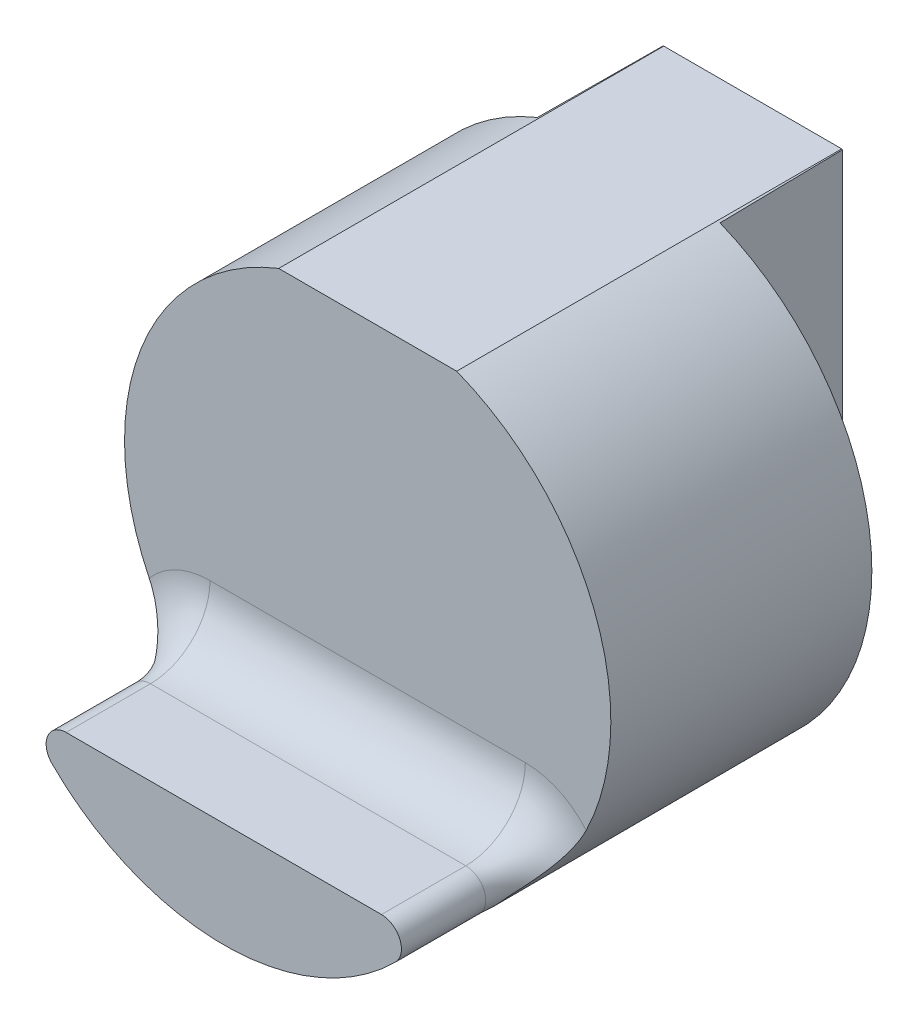
ISO-10303-21;
HEADER;
FILE_DESCRIPTION(('STEP AP214'),'2;1');
FILE_NAME('part.step','',(''),(''),'','','');
FILE_SCHEMA(('AUTOMOTIVE_DESIGN { 1 0 10303 214 1 1 1 1 }'));
ENDSEC;
DATA;
#1=APPLICATION_CONTEXT('core data for automotive mechanical design processes');
#2=APPLICATION_PROTOCOL_DEFINITION('international standard','automotive_design',2000,#1);
#3=PRODUCT_CONTEXT('',#1,'mechanical');
#4=PRODUCT('Part','Part','',(#3));
#5=PRODUCT_RELATED_PRODUCT_CATEGORY('part','',(#4));
#6=PRODUCT_DEFINITION_FORMATION('','',#4);
#7=PRODUCT_DEFINITION_CONTEXT('part definition',#1,'design');
#8=PRODUCT_DEFINITION('design','',#6,#7);
#9=PRODUCT_DEFINITION_SHAPE('','',#8);
#10=(LENGTH_UNIT() NAMED_UNIT(*) SI_UNIT(.MILLI.,.METRE.));
#11=(NAMED_UNIT(*) PLANE_ANGLE_UNIT() SI_UNIT($,.RADIAN.));
#12=(NAMED_UNIT(*) SI_UNIT($,.STERADIAN.) SOLID_ANGLE_UNIT());
#13=UNCERTAINTY_MEASURE_WITH_UNIT(LENGTH_MEASURE(1.E-05),#10,'distance_accuracy_value','');
#14=(GEOMETRIC_REPRESENTATION_CONTEXT(3) GLOBAL_UNCERTAINTY_ASSIGNED_CONTEXT((#13)) GLOBAL_UNIT_ASSIGNED_CONTEXT((#10,
#11,#12)) REPRESENTATION_CONTEXT('',''));
#15=CARTESIAN_POINT('',(0.,0.,0.));
#16=DIRECTION('',(0.,0.,1.));
#17=DIRECTION('',(1.,0.,0.));
#18=AXIS2_PLACEMENT_3D('',#15,#16,#17);
#19=CARTESIAN_POINT('',(7.44185940514708,13.0730877781152,9.8552));
#20=DIRECTION('',(0.,1.,0.));
#21=DIRECTION('',(0.,0.,1.));
#22=AXIS2_PLACEMENT_3D('',#19,#20,#21);
#23=PLANE('',#22);
#24=DIRECTION('',(0.,0.,1.));
#25=VECTOR('',#24,1.);
#26=CARTESIAN_POINT('',(-0.628230806099477,13.0730877781153,9.8552));
#27=LINE('',#26,#25);
#28=CARTESIAN_POINT('',(-0.628230806099464,13.0730877781153,13.5382));
#29=VERTEX_POINT('',#28);
#30=CARTESIAN_POINT('',(-0.628230806099515,13.0730877781153,11.3792));
#31=VERTEX_POINT('',#30);
#32=EDGE_CURVE('E238',#29,#31,#27,.F.);
#33=ORIENTED_EDGE('',*,*,#32,.F.);
#34=DIRECTION('',(1.,0.,0.));
#35=VECTOR('',#34,1.);
#36=CARTESIAN_POINT('',(8.1807441310957,13.0730877781152,13.5382));
#37=LINE('',#36,#35);
#38=CARTESIAN_POINT('',(7.44185940514708,13.0730877781152,13.5382));
#39=VERTEX_POINT('',#38);
#40=EDGE_CURVE('E235',#39,#29,#37,.F.);
#41=ORIENTED_EDGE('',*,*,#40,.F.);
#42=DIRECTION('',(0.,0.,1.));
#43=VECTOR('',#42,1.);
#44=CARTESIAN_POINT('',(7.44185940514708,13.0730877781152,9.8552));
#45=LINE('',#44,#43);
#46=CARTESIAN_POINT('',(7.44185940514708,13.0730877781152,11.3792));
#47=VERTEX_POINT('',#46);
#48=EDGE_CURVE('E243',#47,#39,#45,.T.);
#49=ORIENTED_EDGE('',*,*,#48,.F.);
#50=DIRECTION('',(1.,0.,0.));
#51=VECTOR('',#50,1.);
#52=CARTESIAN_POINT('',(-0.628230806099527,13.0730877781153,11.3792));
#53=LINE('',#52,#51);
#54=EDGE_CURVE('E291',#47,#31,#53,.F.);
#55=ORIENTED_EDGE('',*,*,#54,.T.);
#56=EDGE_LOOP('',(#33,#41,#49,#55));
#57=FACE_BOUND('',#56,.T.);
#58=ADVANCED_FACE('F17',(#57),#23,.T.);
#59=CARTESIAN_POINT('',(-0.628230806099527,14.5970877781153,11.3792));
#60=DIRECTION('',(1.,0.,0.));
#61=DIRECTION('',(0.,0.,-1.));
#62=AXIS2_PLACEMENT_3D('',#59,#60,#61);
#63=CYLINDRICAL_SURFACE('',#62,1.524);
#64=CARTESIAN_POINT('',(-0.628230806099528,14.5970877781153,11.3792));
#65=DIRECTION('',(1.,0.,0.));
#66=DIRECTION('',(0.,1.,0.));
#67=AXIS2_PLACEMENT_3D('',#64,#65,#66);
#68=CIRCLE('',#67,1.52399999999997);
#69=CARTESIAN_POINT('',(-0.628230806099528,14.5970877781153,9.8552));
#70=VERTEX_POINT('',#69);
#71=EDGE_CURVE('E114',#70,#31,#68,.F.);
#72=ORIENTED_EDGE('',*,*,#71,.T.);
#73=ORIENTED_EDGE('',*,*,#54,.F.);
#74=CARTESIAN_POINT('',(7.44185940514708,14.5970877781152,11.3792));
#75=DIRECTION('',(1.,0.,0.));
#76=DIRECTION('',(0.,1.,0.));
#77=AXIS2_PLACEMENT_3D('',#74,#75,#76);
#78=CIRCLE('',#77,1.524);
#79=CARTESIAN_POINT('',(7.44185940514708,14.5970877781151,9.85520000000001));
#80=VERTEX_POINT('',#79);
#81=EDGE_CURVE('E244',#47,#80,#78,.T.);
#82=ORIENTED_EDGE('',*,*,#81,.T.);
#83=DIRECTION('',(1.,0.,0.));
#84=VECTOR('',#83,1.);
#85=CARTESIAN_POINT('',(9.9409632384777,14.5970877781153,9.8552));
#86=LINE('',#85,#84);
#87=EDGE_CURVE('E209',#70,#80,#86,.T.);
#88=ORIENTED_EDGE('',*,*,#87,.F.);
#89=EDGE_LOOP('',(#72,#73,#82,#88));
#90=FACE_BOUND('',#89,.T.);
#91=ADVANCED_FACE('F412',(#90),#63,.F.);
#92=CARTESIAN_POINT('',(1.07001429952392,23.371277808622,3.175));
#93=DIRECTION('',(0.,0.,1.));
#94=DIRECTION('',(1.,0.,0.));
#95=AXIS2_PLACEMENT_3D('',#92,#93,#94);
#96=PLANE('',#95);
#97=DIRECTION('',(0.,1.,0.));
#98=VECTOR('',#97,1.);
#99=CARTESIAN_POINT('',(1.07001429952392,23.3865683155298,3.175));
#100=LINE('',#99,#98);
#101=CARTESIAN_POINT('',(1.0700142995239,22.371277808622,3.17500000000002));
#102=VERTEX_POINT('',#101);
#103=CARTESIAN_POINT('',(1.07001429952377,10.8360977476086,3.17500000000002));
#104=VERTEX_POINT('',#103);
#105=EDGE_CURVE('E188',#102,#104,#100,.F.);
#106=ORIENTED_EDGE('',*,*,#105,.T.);
#107=CARTESIAN_POINT('',(3.40681429952384,16.6036877781153,3.175));
#108=DIRECTION('',(0.,0.,1.));
#109=DIRECTION('',(1.,0.,0.));
#110=AXIS2_PLACEMENT_3D('',#107,#108,#109);
#111=CIRCLE('',#110,6.223);
#112=EDGE_CURVE('E190',#102,#104,#111,.T.);
#113=ORIENTED_EDGE('',*,*,#112,.F.);
#114=EDGE_LOOP('',(#106,#113));
#115=FACE_BOUND('',#114,.T.);
#116=ADVANCED_FACE('F347',(#115),#96,.F.);
#117=CARTESIAN_POINT('',(0.108114299523775,22.6952433586121,0.));
#118=DIRECTION('',(0.,0.,-1.));
#119=DIRECTION('',(-1.,0.,0.));
#120=AXIS2_PLACEMENT_3D('',#117,#118,#119);
#121=PLANE('',#120);
#122=CARTESIAN_POINT('',(3.40681429952384,16.6036877781153,0.));
#123=DIRECTION('',(0.,0.,-1.));
#124=DIRECTION('',(-1.,0.,0.));
#125=AXIS2_PLACEMENT_3D('',#122,#123,#124);
#126=CIRCLE('',#125,6.223);
#127=CARTESIAN_POINT('',(5.68447352776685,22.3948877781152,0.));
#128=VERTEX_POINT('',#127);
#129=CARTESIAN_POINT('',(5.70551429952343,22.3865683155293,-3.91431003653391E-11));
#130=VERTEX_POINT('',#129);
#131=EDGE_CURVE('E306',#128,#130,#126,.T.);
#132=ORIENTED_EDGE('',*,*,#131,.T.);
#133=DIRECTION('',(0.,1.,0.));
#134=VECTOR('',#133,1.);
#135=CARTESIAN_POINT('',(5.70551429952297,23.3865683155297,-7.83002135351651E-11));
#136=LINE('',#135,#134);
#137=CARTESIAN_POINT('',(5.7055142995233,10.8208072407012,-3.9142319580013E-11));
#138=VERTEX_POINT('',#137);
#139=EDGE_CURVE('E307',#130,#138,#136,.F.);
#140=ORIENTED_EDGE('',*,*,#139,.T.);
#141=CARTESIAN_POINT('',(3.40681429952384,16.6036877781153,0.));
#142=DIRECTION('',(0.,0.,1.));
#143=DIRECTION('',(1.,0.,0.));
#144=AXIS2_PLACEMENT_3D('',#141,#142,#143);
#145=CIRCLE('',#144,6.223);
#146=CARTESIAN_POINT('',(1.10811429952375,10.8208072407015,1.01325033446495E-12));
#147=VERTEX_POINT('',#146);
#148=EDGE_CURVE('E336',#147,#138,#145,.T.);
#149=ORIENTED_EDGE('',*,*,#148,.F.);
#150=DIRECTION('',(0.,1.,0.));
#151=VECTOR('',#150,1.);
#152=CARTESIAN_POINT('',(1.1081142995239,23.3865683155298,2.02897594558937E-12));
#153=LINE('',#152,#151);
#154=CARTESIAN_POINT('',(1.10811429952388,22.3865683155292,1.01481058393968E-12));
#155=VERTEX_POINT('',#154);
#156=EDGE_CURVE('E186',#147,#155,#153,.T.);
#157=ORIENTED_EDGE('',*,*,#156,.T.);
#158=CARTESIAN_POINT('',(3.40681429952384,16.6036877781153,0.));
#159=DIRECTION('',(0.,0.,-1.));
#160=DIRECTION('',(-1.,0.,0.));
#161=AXIS2_PLACEMENT_3D('',#158,#159,#160);
#162=CIRCLE('',#161,6.223);
#163=CARTESIAN_POINT('',(1.12915507128086,22.3948877781152,0.));
#164=VERTEX_POINT('',#163);
#165=EDGE_CURVE('E20',#155,#164,#162,.T.);
#166=ORIENTED_EDGE('',*,*,#165,.T.);
#167=DIRECTION('',(1.,0.,0.));
#168=VECTOR('',#167,1.);
#169=CARTESIAN_POINT('',(5.68447352776686,22.3948877781152,0.));
#170=LINE('',#169,#168);
#171=EDGE_CURVE('E118',#128,#164,#170,.F.);
#172=ORIENTED_EDGE('',*,*,#171,.F.);
#173=EDGE_LOOP('',(#132,#140,#149,#157,#166,#172));
#174=FACE_BOUND('',#173,.T.);
#175=ADVANCED_FACE('F312',(#174),#121,.T.);
#176=CARTESIAN_POINT('',(10.629814299524,23.3712778086219,3.175));
#177=DIRECTION('',(0.,0.,1.));
#178=DIRECTION('',(1.,0.,0.));
#179=AXIS2_PLACEMENT_3D('',#176,#177,#178);
#180=PLANE('',#179);
#181=DIRECTION('',(0.,1.,0.));
#182=VECTOR('',#181,1.);
#183=CARTESIAN_POINT('',(5.74361429952392,23.3865683155297,3.175));
#184=LINE('',#183,#182);
#185=CARTESIAN_POINT('',(5.74361429952377,10.8360977476086,3.17500000000002));
#186=VERTEX_POINT('',#185);
#187=CARTESIAN_POINT('',(5.74361429952391,22.3712778086219,3.17500000000002));
#188=VERTEX_POINT('',#187);
#189=EDGE_CURVE('E283',#186,#188,#184,.T.);
#190=ORIENTED_EDGE('',*,*,#189,.T.);
#191=CARTESIAN_POINT('',(3.40681429952384,16.6036877781153,3.175));
#192=DIRECTION('',(0.,0.,1.));
#193=DIRECTION('',(1.,0.,0.));
#194=AXIS2_PLACEMENT_3D('',#191,#192,#193);
#195=CIRCLE('',#194,6.223);
#196=EDGE_CURVE('E326',#186,#188,#195,.T.);
#197=ORIENTED_EDGE('',*,*,#196,.F.);
#198=EDGE_LOOP('',(#190,#197));
#199=FACE_BOUND('',#198,.T.);
#200=ADVANCED_FACE('F324',(#199),#180,.F.);
#201=CARTESIAN_POINT('',(5.74361429952392,23.3865683155297,3.175));
#202=DIRECTION('',(-0.999928007775067,0.,0.011999136093302));
#203=DIRECTION('',(0.011999136093302,0.,0.999928007775067));
#204=AXIS2_PLACEMENT_3D('',#201,#202,#203);
#205=PLANE('',#204);
#206=ORIENTED_EDGE('',*,*,#189,.F.);
#207=CARTESIAN_POINT('',(3.40681429952384,16.6036877781153,-191.558333333314));
#208=DIRECTION('',(-0.999928007775067,0.,0.011999136093302));
#209=DIRECTION('',(0.011999136093302,0.,0.999928007775067));
#210=AXIS2_PLACEMENT_3D('',#207,#208,#209);
#211=ELLIPSE('',#210,518.62066998921,6.223);
#212=EDGE_CURVE('E334',#138,#186,#211,.T.);
#213=ORIENTED_EDGE('',*,*,#212,.F.);
#214=ORIENTED_EDGE('',*,*,#139,.F.);
#215=CARTESIAN_POINT('',(3.40681429952384,16.6036877781153,-191.558333333314));
#216=DIRECTION('',(-0.999928007775067,0.,0.011999136093302));
#217=DIRECTION('',(0.011999136093302,0.,0.999928007775067));
#218=AXIS2_PLACEMENT_3D('',#215,#216,#217);
#219=ELLIPSE('',#218,518.62066998921,6.223);
#220=EDGE_CURVE('E331',#188,#130,#219,.T.);
#221=ORIENTED_EDGE('',*,*,#220,.F.);
#222=EDGE_LOOP('',(#206,#213,#214,#221));
#223=FACE_BOUND('',#222,.T.);
#224=ADVANCED_FACE('F267',(#223),#205,.F.);
#225=CARTESIAN_POINT('',(7.44185940514708,12.5615328837385,11.3792));
#226=DIRECTION('',(0.,0.,-1.));
#227=DIRECTION('',(-1.,0.,0.));
#228=AXIS2_PLACEMENT_3D('',#225,#226,#227);
#229=TOROIDAL_SURFACE('',#228,2.03555489437671,1.524);
#230=ORIENTED_EDGE('',*,*,#81,.F.);
#231=CARTESIAN_POINT('',(7.44185940514708,12.5615328837385,11.3792));
#232=DIRECTION('',(0.,0.,1.));
#233=DIRECTION('',(1.,0.,0.));
#234=AXIS2_PLACEMENT_3D('',#231,#232,#233);
#235=CIRCLE('',#234,0.51155489437671);
#236=CARTESIAN_POINT('',(7.80326479755485,12.1994906868894,11.3792));
#237=VERTEX_POINT('',#236);
#238=EDGE_CURVE('E240',#237,#47,#235,.T.);
#239=ORIENTED_EDGE('',*,*,#238,.F.);
#240=CARTESIAN_POINT('',(7.80326479722471,12.1994906865598,11.3792));
#241=CARTESIAN_POINT('',(7.80277626933646,12.1990031189633,11.3760216995167));
#242=CARTESIAN_POINT('',(7.80233977712418,12.1985552230684,11.3728292231472));
#243=CARTESIAN_POINT('',(7.80157596457785,12.1977417402404,11.3664383559064));
#244=CARTESIAN_POINT('',(7.80124807488644,12.19737572742,11.3632400872052));
#245=CARTESIAN_POINT('',(7.80070229385966,12.1967249511565,11.3568377498368));
#246=CARTESIAN_POINT('',(7.80048400677059,12.1964398970312,11.3536337445773));
#247=CARTESIAN_POINT('',(7.80015786998738,12.1959502056481,11.3472201415436));
#248=CARTESIAN_POINT('',(7.80004981052142,12.1957454160998,11.3440105660799));
#249=CARTESIAN_POINT('',(7.79994445705451,12.1954157289464,11.3375859838696));
#250=CARTESIAN_POINT('',(7.79994714622029,12.1952908192029,11.3343709780227));
#251=CARTESIAN_POINT('',(7.8000634420798,12.1951206571112,11.3279356852759));
#252=CARTESIAN_POINT('',(7.80017722744632,12.1950755334092,11.3247153982117));
#253=CARTESIAN_POINT('',(7.8005157162529,12.1950650074966,11.3182696719853));
#254=CARTESIAN_POINT('',(7.80074079176056,12.1950998741444,11.3150442519678));
#255=CARTESIAN_POINT('',(7.8013017089009,12.195249692553,11.3085883703131));
#256=CARTESIAN_POINT('',(7.80163810932814,12.1953650516509,11.3053579667905));
#257=CARTESIAN_POINT('',(7.80242137585325,12.1956765203187,11.2988922103839));
#258=CARTESIAN_POINT('',(7.80286897656323,12.1958731729104,11.2956569728506));
#259=CARTESIAN_POINT('',(7.80387419517786,12.1963481966929,11.2891816241888));
#260=CARTESIAN_POINT('',(7.80443270882849,12.1966272428804,11.2859417019409));
#261=CARTESIAN_POINT('',(7.80565915614579,12.1972683255519,11.2794570454423));
#262=CARTESIAN_POINT('',(7.80632812883864,12.1976311645679,11.2762125874775));
#263=CARTESIAN_POINT('',(7.80777474467053,12.1984414070411,11.2697189086985));
#264=CARTESIAN_POINT('',(7.80855354976164,12.1988897355871,11.2664700627256));
#265=CARTESIAN_POINT('',(7.81021892614097,12.1998728362271,11.2599676506046));
#266=CARTESIAN_POINT('',(7.81110676020189,12.2004086507068,11.2567145661846));
#267=CARTESIAN_POINT('',(7.81298911828452,12.2015688922426,11.2502037042476));
#268=CARTESIAN_POINT('',(7.81398498256644,12.2021944734169,11.2469465206648));
#269=CARTESIAN_POINT('',(7.81608218288511,12.2035367551057,11.240427520484));
#270=CARTESIAN_POINT('',(7.81718491346315,12.2042547166986,11.2371664133031));
#271=CARTESIAN_POINT('',(7.81949432606209,12.2057844076068,11.2306394870642));
#272=CARTESIAN_POINT('',(7.82070243142793,12.2065974973067,11.2273744909128));
#273=CARTESIAN_POINT('',(7.82297305198052,12.2081510915031,11.2214842911234));
#274=CARTESIAN_POINT('',(7.82402227975698,12.208878050314,11.2188503620346));
#275=CARTESIAN_POINT('',(7.82619955837853,12.2104053913487,11.2135438903398));
#276=CARTESIAN_POINT('',(7.82732899681372,12.2112072646338,11.2108723487949));
#277=CARTESIAN_POINT('',(7.83088362150636,12.2137611997551,11.2026860244471));
#278=CARTESIAN_POINT('',(7.83338513225989,12.2156002591118,11.197231224833));
#279=CARTESIAN_POINT('',(7.83868794334671,12.2195908695299,11.1861645491735));
#280=CARTESIAN_POINT('',(7.84149819900505,12.2217542222509,11.180561284643));
#281=CARTESIAN_POINT('',(7.84741008513378,12.2264139827569,11.1691984230749));
#282=CARTESIAN_POINT('',(7.85051922063597,12.2289222534284,11.1634476229168));
#283=CARTESIAN_POINT('',(7.85701754094386,12.2342942968763,11.1517906821894));
#284=CARTESIAN_POINT('',(7.86041271938342,12.2371700397891,11.1458934243673));
#285=CARTESIAN_POINT('',(7.86747010143995,12.2433044334328,11.1339468593758));
#286=CARTESIAN_POINT('',(7.87113681766517,12.2465753801505,11.1279065690935));
#287=CARTESIAN_POINT('',(7.87871735514144,12.2535206619791,11.1156685272175));
#288=CARTESIAN_POINT('',(7.88263397021578,12.2572071897591,11.1094794073643));
#289=CARTESIAN_POINT('',(7.89070627411873,12.2650444023988,11.0969746292408));
#290=CARTESIAN_POINT('',(7.89486380814891,12.2692092531837,11.0906691143832));
#291=CARTESIAN_POINT('',(7.90652165074149,12.2811744941441,11.0730015418435));
#292=CARTESIAN_POINT('',(7.91396952784872,12.2891574370218,11.0617298769385));
#293=CARTESIAN_POINT('',(7.92867708184577,12.3055283307801,11.039199954122));
#294=CARTESIAN_POINT('',(7.93593500115611,12.3139187999749,11.0279423868628));
#295=CARTESIAN_POINT('',(7.95737258081358,12.3396507397695,10.9941142437998));
#296=CARTESIAN_POINT('',(7.97112339523107,12.3574570650557,10.9716250018921));
#297=CARTESIAN_POINT('',(7.99104164643011,12.3838730621499,10.9368872542296));
#298=CARTESIAN_POINT('',(7.99761483036594,12.3927018401875,10.9250375390244));
#299=CARTESIAN_POINT('',(8.01028069807797,12.4096548841923,10.9015750915841));
#300=CARTESIAN_POINT('',(8.01638155865236,12.4177928609125,10.8899766506574));
#301=CARTESIAN_POINT('',(8.02820902785046,12.4333242104752,10.8670452804821));
#302=CARTESIAN_POINT('',(8.03393958285671,12.4407345808681,10.8557261739539));
#303=CARTESIAN_POINT('',(8.04514358958892,12.4545371007416,10.8332574273366));
#304=CARTESIAN_POINT('',(8.05061582695396,12.4609614015249,10.8221268250645));
#305=CARTESIAN_POINT('',(8.06676462528863,12.4795644549169,10.7894256355564));
#306=CARTESIAN_POINT('',(8.07754130425058,12.4915297965863,10.7677870905019));
#307=CARTESIAN_POINT('',(8.0994432513503,12.5163085719364,10.7247838758054));
#308=CARTESIAN_POINT('',(8.11057109040984,12.5291301051351,10.7034251222185));
#309=CARTESIAN_POINT('',(8.1332134104003,12.5553669233386,10.660877337587));
#310=CARTESIAN_POINT('',(8.14473086812072,12.5687873455658,10.6396930935078));
#311=CARTESIAN_POINT('',(8.16815783456962,12.5963744669354,10.5976111008827));
#312=CARTESIAN_POINT('',(8.18007032827184,12.6105479719352,10.5767194460418));
#313=CARTESIAN_POINT('',(8.20429244583889,12.6396680512733,10.5352832983496));
#314=CARTESIAN_POINT('',(8.21660503924818,12.6546215623986,10.5147454158693));
#315=CARTESIAN_POINT('',(8.24162696481737,12.6853455082611,10.4740965450279));
#316=CARTESIAN_POINT('',(8.25433917181887,12.701123121874,10.4539927413519));
#317=CARTESIAN_POINT('',(8.28015834621935,12.7335168685615,10.4142907193828));
#318=CARTESIAN_POINT('',(8.29326806268148,12.7501400888985,10.3947000670488));
#319=CARTESIAN_POINT('',(8.31988401713374,12.7842296722552,10.3561049305962));
#320=CARTESIAN_POINT('',(8.33339290286563,12.8017027797382,10.3371082201544));
#321=CARTESIAN_POINT('',(8.35895211658399,12.8350787060286,10.3023093462681));
#322=CARTESIAN_POINT('',(8.3709710634484,12.8509009703938,10.2864068293774));
#323=CARTESIAN_POINT('',(8.39554210916229,12.8835721577126,10.2548319471721));
#324=CARTESIAN_POINT('',(8.40809939899572,12.9004376347349,10.2391807134574));
#325=CARTESIAN_POINT('',(8.43373665285962,12.9352513529559,10.20821421312));
#326=CARTESIAN_POINT('',(8.44682117632324,12.9532168287318,10.192922076695));
#327=CARTESIAN_POINT('',(8.47349408814471,12.9902830429707,10.1627879003692));
#328=CARTESIAN_POINT('',(8.4870862300165,13.0094015339979,10.1479709926319));
#329=CARTESIAN_POINT('',(8.51475029298797,13.0488165932934,10.1189078072345));
#330=CARTESIAN_POINT('',(8.52882509582776,13.0691311155991,10.1046885977731));
#331=CARTESIAN_POINT('',(8.55742501669026,13.11097109621,10.0769478676661));
#332=CARTESIAN_POINT('',(8.57195208979849,13.1325144186085,10.0634552783977));
#333=CARTESIAN_POINT('',(8.60142131519471,13.1768335719241,10.0373011207428));
#334=CARTESIAN_POINT('',(8.61636444424349,13.1996268831208,10.0246702573455));
#335=CARTESIAN_POINT('',(8.64662935366883,13.2464532197169,10.000377533747));
#336=CARTESIAN_POINT('',(8.66195120996083,13.2705030054676,9.98874801305764));
#337=CARTESIAN_POINT('',(8.69000364892189,13.3151939312455,9.9686898684632));
#338=CARTESIAN_POINT('',(8.70274122193872,13.3357364455688,9.96005061167451));
#339=CARTESIAN_POINT('',(8.72850344007481,13.3778399493115,9.94352611060824));
#340=CARTESIAN_POINT('',(8.7415260151163,13.3994133116631,9.9356691034115));
#341=CARTESIAN_POINT('',(8.76781814489794,13.4435823798128,9.9208171399895));
#342=CARTESIAN_POINT('',(8.78108464023432,13.4661898841419,9.91385184036398));
#343=CARTESIAN_POINT('',(8.80781762329148,13.5124242794123,9.90089477199973));
#344=CARTESIAN_POINT('',(8.82127997319356,13.536062263872,9.89493401507831));
#345=CARTESIAN_POINT('',(8.8483537008799,13.5843440243563,9.88409999888982));
#346=CARTESIAN_POINT('',(8.86195986327308,13.608997975907,9.8792590175649));
#347=CARTESIAN_POINT('',(8.88926571423904,13.6592872970291,9.87078033836097));
#348=CARTESIAN_POINT('',(8.90295910127299,13.6849317341609,9.86717608125996));
#349=CARTESIAN_POINT('',(8.93037956345733,13.7371660352363,9.86128798201485));
#350=CARTESIAN_POINT('',(8.94409925324978,13.7637636733265,9.85903863295932));
#351=CARTESIAN_POINT('',(8.97150920579354,13.8178550632393,9.85597657055503));
#352=CARTESIAN_POINT('',(8.98519103181632,13.8453550955322,9.85519924397879));
#353=CARTESIAN_POINT('',(8.99866830757967,13.872955687157,9.85520000000003));
#354=B_SPLINE_CURVE_WITH_KNOTS('',3,(#240,#241,#242,#243,#244,#245,#246,#247,#248,#249,#250,
#251,#252,#253,#254,#255,#256,#257,#258,#259,#260,#261,#262,#263,#264,#265,#266,#267,#268,#269,
#270,#271,#272,#273,#274,#275,#276,#277,#278,#279,#280,#281,#282,#283,#284,#285,#286,#287,#288,
#289,#290,#291,#292,#293,#294,#295,#296,#297,#298,#299,#300,#301,#302,#303,#304,#305,#306,#307,
#308,#309,#310,#311,#312,#313,#314,#315,#316,#317,#318,#319,#320,#321,#322,#323,#324,#325,#326,
#327,#328,#329,#330,#331,#332,#333,#334,#335,#336,#337,#338,#339,#340,#341,#342,#343,#344,#345,
#346,#347,#348,#349,#350,#351,#352,#353),.UNSPECIFIED.,.F.,.F.,(4,2,2,2,2,2,2,2,2,2,2,2,2,2,2,2,
2,2,2,2,2,2,2,2,2,2,2,2,2,2,2,2,2,2,2,2,2,2,2,2,2,2,2,2,2,2,2,2,2,2,2,2,2,2,2,2,4),(0.,
0.00975658435291592,0.0194611781056364,0.0291304738228363,0.0387813335861803,0.0484307264697266,
0.0580956637971927,0.0677931338780923,0.0775400379507442,0.0873531289925061,0.097248954898178,
0.107243807291982,0.117353676948933,0.127594216483429,0.137980710641775,0.148528054233753,
0.159250737473754,0.1680303936155,0.177057264853576,0.195877968860215,0.215765038406735,
0.236764925107217,0.258921137795347,0.282275208221798,0.306867528666619,0.332738080386935,
0.379807443284347,0.427218321048523,0.522612017878417,0.571125054471116,0.617399764776557,
0.661461797997247,0.70335709544914,0.784273593044841,0.866110610579148,0.948890048343324,
1.03262117039109,1.11730047485599,1.20291161455501,1.28942543881206,1.37680023335302,
1.45313478980857,1.53175388523348,1.612667091173,1.69587917675124,1.78138982600899,
1.86919336200433,1.95927849822755,2.05162813992319,2.12861259417072,2.20777443447883,
2.28911373528486,2.37262800185457,2.45831205742456,2.5461579451542,2.6361548521975,
2.72828906339623),.UNSPECIFIED.);
#355=CARTESIAN_POINT('',(8.99866830757972,13.872955687157,9.85520000000001));
#356=VERTEX_POINT('',#355);
#357=EDGE_CURVE('E183',#356,#237,#354,.F.);
#358=ORIENTED_EDGE('',*,*,#357,.F.);
#359=CARTESIAN_POINT('',(7.44185940514708,12.5615328837385,9.85520000000003));
#360=DIRECTION('',(0.,0.,1.));
#361=DIRECTION('',(0.764808115336825,0.644258136708365,0.));
#362=AXIS2_PLACEMENT_3D('',#359,#360,#361);
#363=CIRCLE('',#362,2.03555489437666);
#364=EDGE_CURVE('E119',#80,#356,#363,.F.);
#365=ORIENTED_EDGE('',*,*,#364,.F.);
#366=EDGE_LOOP('',(#230,#239,#358,#365));
#367=FACE_BOUND('',#366,.T.);
#368=ADVANCED_FACE('F256',(#367),#229,.F.);
#369=CARTESIAN_POINT('',(7.44185940514708,12.5615328837385,9.8552));
#370=DIRECTION('',(0.,0.,1.));
#371=DIRECTION('',(1.,0.,0.));
#372=AXIS2_PLACEMENT_3D('',#369,#370,#371);
#373=CYLINDRICAL_SURFACE('',#372,0.51155489437671);
#374=CARTESIAN_POINT('',(7.44185940514708,12.5615328837385,13.5382));
#375=DIRECTION('',(0.,0.,1.));
#376=DIRECTION('',(1.,0.,0.));
#377=AXIS2_PLACEMENT_3D('',#374,#375,#376);
#378=CIRCLE('',#377,0.51155489437671);
#379=CARTESIAN_POINT('',(7.80326479854528,12.1994906878781,13.5382));
#380=VERTEX_POINT('',#379);
#381=EDGE_CURVE('E239',#380,#39,#378,.T.);
#382=ORIENTED_EDGE('',*,*,#381,.F.);
#383=DIRECTION('',(0.,0.,1.));
#384=VECTOR('',#383,1.);
#385=CARTESIAN_POINT('',(7.80326479722471,12.1994906865598,-0.100000000000006));
#386=LINE('',#385,#384);
#387=EDGE_CURVE('E180',#237,#380,#386,.T.);
#388=ORIENTED_EDGE('',*,*,#387,.F.);
#389=ORIENTED_EDGE('',*,*,#238,.T.);
#390=ORIENTED_EDGE('',*,*,#48,.T.);
#391=EDGE_LOOP('',(#382,#388,#389,#390));
#392=FACE_BOUND('',#391,.T.);
#393=ADVANCED_FACE('F266',(#392),#373,.T.);
#394=CARTESIAN_POINT('',(8.1807441310957,13.1403976120055,13.5382));
#395=DIRECTION('',(0.,0.,1.));
#396=DIRECTION('',(1.,0.,0.));
#397=AXIS2_PLACEMENT_3D('',#394,#395,#396);
#398=PLANE('',#397);
#399=CARTESIAN_POINT('',(-0.628230806099451,12.5615328837386,13.5382));
#400=DIRECTION('',(0.,0.,1.));
#401=DIRECTION('',(1.,0.,0.));
#402=AXIS2_PLACEMENT_3D('',#399,#400,#401);
#403=CIRCLE('',#402,0.511554894376735);
#404=CARTESIAN_POINT('',(-0.989636202480874,12.1994906908561,13.5382));
#405=VERTEX_POINT('',#404);
#406=EDGE_CURVE('E288',#405,#29,#403,.F.);
#407=ORIENTED_EDGE('',*,*,#406,.F.);
#408=CARTESIAN_POINT('',(3.40681429952384,16.6036877781153,13.5382));
#409=DIRECTION('',(0.,0.,1.));
#410=DIRECTION('',(1.,0.,0.));
#411=AXIS2_PLACEMENT_3D('',#408,#409,#410);
#412=CIRCLE('',#411,6.223);
#413=EDGE_CURVE('E145',#380,#405,#412,.F.);
#414=ORIENTED_EDGE('',*,*,#413,.F.);
#415=ORIENTED_EDGE('',*,*,#381,.T.);
#416=ORIENTED_EDGE('',*,*,#40,.T.);
#417=EDGE_LOOP('',(#407,#414,#415,#416));
#418=FACE_BOUND('',#417,.T.);
#419=ADVANCED_FACE('F375',(#418),#398,.T.);
#420=CARTESIAN_POINT('',(-0.628230806099451,12.5615328837386,9.8552));
#421=DIRECTION('',(0.,0.,1.));
#422=DIRECTION('',(1.,0.,0.));
#423=AXIS2_PLACEMENT_3D('',#420,#421,#422);
#424=CYLINDRICAL_SURFACE('',#423,0.511554894376735);
#425=DIRECTION('',(0.,0.,1.));
#426=VECTOR('',#425,1.);
#427=CARTESIAN_POINT('',(-0.989636204143507,12.1994906925158,-0.100000000000006));
#428=LINE('',#427,#426);
#429=CARTESIAN_POINT('',(-0.989636205034001,12.1994906934047,11.3791999979195));
#430=VERTEX_POINT('',#429);
#431=EDGE_CURVE('E134',#405,#430,#428,.F.);
#432=ORIENTED_EDGE('',*,*,#431,.F.);
#433=ORIENTED_EDGE('',*,*,#406,.T.);
#434=ORIENTED_EDGE('',*,*,#32,.T.);
#435=CARTESIAN_POINT('',(-0.628230806099527,12.5615328837386,11.3792));
#436=DIRECTION('',(0.,0.,-1.));
#437=DIRECTION('',(-1.,0.,0.));
#438=AXIS2_PLACEMENT_3D('',#435,#436,#437);
#439=CIRCLE('',#438,0.511554894376684);
#440=EDGE_CURVE('E216',#31,#430,#439,.F.);
#441=ORIENTED_EDGE('',*,*,#440,.T.);
#442=EDGE_LOOP('',(#432,#433,#434,#441));
#443=FACE_BOUND('',#442,.T.);
#444=ADVANCED_FACE('F369',(#443),#424,.T.);
#445=CARTESIAN_POINT('',(-0.628230806099527,12.5615328837386,11.3792));
#446=DIRECTION('',(0.,0.,-1.));
#447=DIRECTION('',(-1.,0.,0.));
#448=AXIS2_PLACEMENT_3D('',#445,#446,#447);
#449=TOROIDAL_SURFACE('',#448,2.03555489437666,1.52399999999997);
#450=CARTESIAN_POINT('',(-1.32464560307131,12.5615328837386,10.6516838149413));
#451=CARTESIAN_POINT('',(-1.31826109317874,12.5540578887909,10.6634365768289));
#452=CARTESIAN_POINT('',(-1.31198928171974,12.5463936027951,10.6751276653627));
#453=CARTESIAN_POINT('',(-1.29952376372517,12.5306460538748,10.6985069020291));
#454=CARTESIAN_POINT('',(-1.29333183994307,12.5225589270558,10.7101934025964));
#455=CARTESIAN_POINT('',(-1.28095033559426,12.5060030919414,10.7335483562256));
#456=CARTESIAN_POINT('',(-1.27476170210472,12.4975309357885,10.7452148558473));
#457=CARTESIAN_POINT('',(-1.26230811220425,12.4802481603227,10.7685221127339));
#458=CARTESIAN_POINT('',(-1.25604316980291,12.471434632266,10.7801607209903));
#459=CARTESIAN_POINT('',(-1.2433584918663,12.4534817679983,10.8033809958091));
#460=CARTESIAN_POINT('',(-1.23693780138686,12.4443397061786,10.8149600292217));
#461=CARTESIAN_POINT('',(-1.22349552751848,12.4253645567668,10.8387506644545));
#462=CARTESIAN_POINT('',(-1.2164626992309,12.4155266030588,10.8509519943955));
#463=CARTESIAN_POINT('',(-1.20249133191666,12.3963245825716,10.8746290176049));
#464=CARTESIAN_POINT('',(-1.19556445440302,12.3869604227132,10.886111442024));
#465=CARTESIAN_POINT('',(-1.18508349896543,12.3729914158952,10.9029122246303));
#466=CARTESIAN_POINT('',(-1.18164189955752,12.3684350966698,10.9083411406076));
#467=CARTESIAN_POINT('',(-1.17450530486879,12.359130388585,10.9194695683427));
#468=CARTESIAN_POINT('',(-1.17080642364779,12.3543842906665,10.9251685148128));
#469=CARTESIAN_POINT('',(-1.15965022545475,12.3403995638436,10.9422826339762));
#470=CARTESIAN_POINT('',(-1.15208793875356,12.3313520574012,10.953786000103));
#471=CARTESIAN_POINT('',(-1.13675900624933,12.3137322890839,10.9768362008704));
#472=CARTESIAN_POINT('',(-1.12899441741254,12.3051568677721,10.9883819946023));
#473=CARTESIAN_POINT('',(-1.11648062571998,12.2919425040252,11.0069657821686));
#474=CARTESIAN_POINT('',(-1.11179477526548,12.2871259962945,11.0139193636726));
#475=CARTESIAN_POINT('',(-1.10265058196015,12.2780196861277,11.0276289665926));
#476=CARTESIAN_POINT('',(-1.09819326553134,12.2737155030109,11.0343760830783));
#477=CARTESIAN_POINT('',(-1.08952333430185,12.2655758458024,11.0476495870477));
#478=CARTESIAN_POINT('',(-1.08531057447591,12.2617276116519,11.0541680664812));
#479=CARTESIAN_POINT('',(-1.07715069213958,12.2544719687493,11.0669859185673));
#480=CARTESIAN_POINT('',(-1.0732019214694,12.2510519410852,11.0732770788423));
#481=CARTESIAN_POINT('',(-1.06558585127094,12.2446211893418,11.0856362556975));
#482=CARTESIAN_POINT('',(-1.06191551950887,12.2415982299665,11.0916960241144));
#483=CARTESIAN_POINT('',(-1.05486988561746,12.2359349065407,11.1035902571444));
#484=CARTESIAN_POINT('',(-1.05149012801296,12.2332824650877,11.1094163108877));
#485=CARTESIAN_POINT('',(-1.04503655115325,12.2283359687582,11.1208407789963));
#486=CARTESIAN_POINT('',(-1.04195682407298,12.2260298732855,11.1264306150065));
#487=CARTESIAN_POINT('',(-1.03611274162654,12.221755738606,11.1373811604771));
#488=CARTESIAN_POINT('',(-1.03334091142649,12.2197754634553,11.1427330733093));
#489=CARTESIAN_POINT('',(-1.02811849261517,12.2161333564186,11.1532049563964));
#490=CARTESIAN_POINT('',(-1.02565886797177,12.2144590348231,11.1583160280222));
#491=CARTESIAN_POINT('',(-1.02107130746465,12.2114200705224,11.1683088968396));
#492=CARTESIAN_POINT('',(-1.01893221448828,12.2100419077591,11.1731813909215));
#493=CARTESIAN_POINT('',(-1.01549203214562,12.2078874390677,11.1814398084753));
#494=CARTESIAN_POINT('',(-1.01414471759768,12.207061196205,11.1847936497182));
#495=CARTESIAN_POINT('',(-1.01153894378625,12.2054892158927,11.1915010896326));
#496=CARTESIAN_POINT('',(-1.01027954794543,12.20474256145,11.1948541097069));
#497=CARTESIAN_POINT('',(-1.00785381974824,12.2033306110295,11.2015618477373));
#498=CARTESIAN_POINT('',(-1.00668652723911,12.2026644212052,11.2049160293396));
#499=CARTESIAN_POINT('',(-1.00444524347129,12.2014096950262,11.2116252989261));
#500=CARTESIAN_POINT('',(-1.00337032843698,12.2008203488937,11.2149799267768));
#501=CARTESIAN_POINT('',(-1.00131487865584,12.1997170721543,11.2216900164427));
#502=CARTESIAN_POINT('',(-1.00033345599943,12.1992024011008,11.2250450841353));
#503=CARTESIAN_POINT('',(-0.998465659217163,12.1982461238289,11.2317557947182));
#504=CARTESIAN_POINT('',(-0.997578447061096,12.1978038503308,11.2351111090412));
#505=CARTESIAN_POINT('',(-0.995899669077662,12.1969903225949,11.2418221070701));
#506=CARTESIAN_POINT('',(-0.995107325001758,12.196618473475,11.2451775237621));
#507=CARTESIAN_POINT('',(-0.99361873111614,12.1959439458857,11.2518885118561));
#508=CARTESIAN_POINT('',(-0.992921772967076,12.1956407452015,11.2552438734854));
#509=CARTESIAN_POINT('',(-0.99162427931879,12.1951018927983,11.2619545454254));
#510=CARTESIAN_POINT('',(-0.991023114477153,12.1948657914644,11.265309697825));
#511=CARTESIAN_POINT('',(-0.989917416797201,12.1944597361378,11.2720197504687));
#512=CARTESIAN_POINT('',(-0.989412341749441,12.1942894050418,11.2753745384579));
#513=CARTESIAN_POINT('',(-0.988498921522648,12.1940137111326,11.2820836686442));
#514=CARTESIAN_POINT('',(-0.988090128227422,12.193908043532,11.2854379372509));
#515=CARTESIAN_POINT('',(-0.987369262701568,12.1937607198199,11.2921458426907));
#516=CARTESIAN_POINT('',(-0.987056842101251,12.1937188309453,11.2954994369428));
#517=CARTESIAN_POINT('',(-0.986528611163398,12.1936983302969,11.3022058160584));
#518=CARTESIAN_POINT('',(-0.986312556424154,12.1937195573878,11.3055585811658));
#519=CARTESIAN_POINT('',(-0.985976848144982,12.1938247764211,11.3122631332425));
#520=CARTESIAN_POINT('',(-0.98585705687049,12.1939086783546,11.3156149147253));
#521=CARTESIAN_POINT('',(-0.985713571455965,12.1941389565512,11.3223173398945));
#522=CARTESIAN_POINT('',(-0.985689847368326,12.194285313329,11.3256679836097));
#523=CARTESIAN_POINT('',(-0.985738098815336,12.1946404317005,11.3323679832243));
#524=CARTESIAN_POINT('',(-0.985810151711178,12.194849243635,11.3357173358942));
#525=CARTESIAN_POINT('',(-0.986049470279513,12.1953294231983,11.342414611514));
#526=CARTESIAN_POINT('',(-0.986216918569194,12.1956009102125,11.3457625193606));
#527=CARTESIAN_POINT('',(-0.986646442354978,12.1962068092062,11.352456776912));
#528=CARTESIAN_POINT('',(-0.986908802128194,12.1965414087626,11.35580309137));
#529=CARTESIAN_POINT('',(-0.987527501659154,12.1972741226383,11.3624940259163));
#530=CARTESIAN_POINT('',(-0.987884222458122,12.1976724918319,11.3658385827637));
#531=CARTESIAN_POINT('',(-0.98869079367811,12.1985335408457,11.3725259359668));
#532=CARTESIAN_POINT('',(-0.989141115073512,12.1989965418504,11.3758686342186));
#533=CARTESIAN_POINT('',(-0.989636205033998,12.1994906934047,11.3791999979195));
#534=B_SPLINE_CURVE_WITH_KNOTS('',3,(#450,#451,#452,#453,#454,#455,#456,#457,#458,#459,#460,
#461,#462,#463,#464,#465,#466,#467,#468,#469,#470,#471,#472,#473,#474,#475,#476,#477,#478,#479,
#480,#481,#482,#483,#484,#485,#486,#487,#488,#489,#490,#491,#492,#493,#494,#495,#496,#497,#498,
#499,#500,#501,#502,#503,#504,#505,#506,#507,#508,#509,#510,#511,#512,#513,#514,#515,#516,#517,
#518,#519,#520,#521,#522,#523,#524,#525,#526,#527,#528,#529,#530,#531,#532,#533),.UNSPECIFIED.,
.F.,.F.,(4,2,2,2,2,2,2,2,2,2,2,2,2,2,2,2,2,2,2,2,2,2,2,2,2,2,2,2,2,2,2,2,2,2,2,2,2,2,2,2,2,4),
(0.,0.0459617244770227,0.0924633195553729,0.139531288895538,0.187188250877786,0.235454876309368,
0.286990529370608,0.336053912326351,0.359690326883865,0.384552326651611,0.433962034901323,
0.482985906700946,0.511991731962989,0.539468720825291,0.565453718348985,0.589981503244733,
0.613085368643193,0.634797771488829,0.655151078576727,0.674178447690428,0.691914896550732,
0.708398631298648,0.71951965997571,0.730494215647716,0.74133272050268,0.752045735610859,
0.762643955189853,0.77313819890468,0.783539402184988,0.793858604587233,0.804106936279318,
0.814295602777056,0.824435868113625,0.834539036672498,0.844616433958621,0.854679386619275,
0.864739202053239,0.874807147962527,0.88489443220451,0.895012183293086,0.905171431876419,
0.915383093486796),.UNSPECIFIED.);
#535=CARTESIAN_POINT('',(-1.32464560307133,12.5615328837386,10.6516838149413));
#536=VERTEX_POINT('',#535);
#537=EDGE_CURVE('E131',#430,#536,#534,.F.);
#538=ORIENTED_EDGE('',*,*,#537,.F.);
#539=ORIENTED_EDGE('',*,*,#440,.F.);
#540=ORIENTED_EDGE('',*,*,#71,.F.);
#541=CARTESIAN_POINT('',(-0.628230806099527,12.5615328837386,9.8552));
#542=DIRECTION('',(0.,0.,1.));
#543=DIRECTION('',(0.,1.,0.));
#544=AXIS2_PLACEMENT_3D('',#541,#542,#543);
#545=CIRCLE('',#544,2.03555489437664);
#546=CARTESIAN_POINT('',(-2.18503970853224,13.8729556871574,9.8552));
#547=VERTEX_POINT('',#546);
#548=EDGE_CURVE('E105',#547,#70,#545,.F.);
#549=ORIENTED_EDGE('',*,*,#548,.F.);
#550=CARTESIAN_POINT('',(-1.32464560307133,12.5615328837385,10.6516838149412));
#551=CARTESIAN_POINT('',(-1.35363874952497,12.5954809430353,10.5982487493101));
#552=CARTESIAN_POINT('',(-1.38352810713594,12.6311971372842,10.5463430223375));
#553=CARTESIAN_POINT('',(-1.44502116559271,12.706532809032,10.4463016173111));
#554=CARTESIAN_POINT('',(-1.47662886022812,12.7461615711372,10.3981754183296));
#555=CARTESIAN_POINT('',(-1.54149222760554,12.8297256609979,10.3064544406863));
#556=CARTESIAN_POINT('',(-1.57475503924682,12.8736806212634,10.2628823615713));
#557=CARTESIAN_POINT('',(-1.64234541895162,12.9656972033574,10.1813936344296));
#558=CARTESIAN_POINT('',(-1.6766717684102,13.0137542283574,10.1434707833494));
#559=CARTESIAN_POINT('',(-1.76242880868166,13.1377525339498,10.0573810225943));
#560=CARTESIAN_POINT('',(-1.81422480462392,13.2160794887708,10.0129284135518));
#561=CARTESIAN_POINT('',(-1.9169079841557,13.3798723409195,9.93991563592032));
#562=CARTESIAN_POINT('',(-1.96779822893274,13.4653041632355,9.91128413370243));
#563=CARTESIAN_POINT('',(-2.04639742203725,13.6050641525261,9.87920666428025));
#564=CARTESIAN_POINT('',(-2.07500444740499,13.657675528234,9.87024308625283));
#565=CARTESIAN_POINT('',(-2.13102253138236,13.7643645065431,9.85822962244883));
#566=CARTESIAN_POINT('',(-2.15843037825849,13.8184454844682,9.85519476825277));
#567=CARTESIAN_POINT('',(-2.18503970853225,13.8729556871574,9.8552));
#568=B_SPLINE_CURVE_WITH_KNOTS('',3,(#550,#551,#552,#553,#554,#555,#556,#557,#558,#559,#560,
#561,#562,#563,#564,#565,#566,#567),.UNSPECIFIED.,.F.,.F.,(4,2,2,2,2,2,2,2,4),(0.,
0.20893860129823,0.418385513221667,0.628831053000438,0.839043785278647,1.14930204299109,
1.45814976134842,1.63951713017168,1.82134374083521),.UNSPECIFIED.);
#569=EDGE_CURVE('E110',#536,#547,#568,.T.);
#570=ORIENTED_EDGE('',*,*,#569,.F.);
#571=EDGE_LOOP('',(#538,#539,#540,#549,#570));
#572=FACE_BOUND('',#571,.T.);
#573=ADVANCED_FACE('F108',(#572),#449,.F.);
#574=CARTESIAN_POINT('',(9.9409632384777,10.0803337991238,9.8552));
#575=DIRECTION('',(0.,0.,1.));
#576=DIRECTION('',(1.,0.,0.));
#577=AXIS2_PLACEMENT_3D('',#574,#575,#576);
#578=PLANE('',#577);
#579=CARTESIAN_POINT('',(3.40681429952384,16.6036877781153,9.8552));
#580=DIRECTION('',(0.,0.,1.));
#581=DIRECTION('',(1.,0.,0.));
#582=AXIS2_PLACEMENT_3D('',#579,#580,#581);
#583=CIRCLE('',#582,6.223);
#584=CARTESIAN_POINT('',(1.12915507128086,22.3948877781152,9.8552));
#585=VERTEX_POINT('',#584);
#586=EDGE_CURVE('E123',#547,#585,#583,.F.);
#587=ORIENTED_EDGE('',*,*,#586,.F.);
#588=ORIENTED_EDGE('',*,*,#548,.T.);
#589=ORIENTED_EDGE('',*,*,#87,.T.);
#590=ORIENTED_EDGE('',*,*,#364,.T.);
#591=CARTESIAN_POINT('',(3.40681429952384,16.6036877781153,9.8552));
#592=DIRECTION('',(0.,0.,1.));
#593=DIRECTION('',(1.,0.,0.));
#594=AXIS2_PLACEMENT_3D('',#591,#592,#593);
#595=CIRCLE('',#594,6.223);
#596=CARTESIAN_POINT('',(5.68447352776685,22.3948877781152,9.8552));
#597=VERTEX_POINT('',#596);
#598=EDGE_CURVE('E443',#597,#356,#595,.F.);
#599=ORIENTED_EDGE('',*,*,#598,.F.);
#600=DIRECTION('',(1.,0.,0.));
#601=VECTOR('',#600,1.);
#602=CARTESIAN_POINT('',(5.68447352776686,22.3948877781152,9.8552));
#603=LINE('',#602,#601);
#604=EDGE_CURVE('E126',#585,#597,#603,.T.);
#605=ORIENTED_EDGE('',*,*,#604,.F.);
#606=EDGE_LOOP('',(#587,#588,#589,#590,#599,#605));
#607=FACE_BOUND('',#606,.T.);
#608=ADVANCED_FACE('F124',(#607),#578,.T.);
#609=CARTESIAN_POINT('',(5.68447352776686,22.3948877781152,0.));
#610=DIRECTION('',(0.,1.,0.));
#611=DIRECTION('',(0.,0.,1.));
#612=AXIS2_PLACEMENT_3D('',#609,#610,#611);
#613=PLANE('',#612);
#614=DIRECTION('',(0.,0.,1.));
#615=VECTOR('',#614,1.);
#616=CARTESIAN_POINT('',(1.1291550712809,22.3948877781153,-0.100000000000006));
#617=LINE('',#616,#615);
#618=EDGE_CURVE('E26',#585,#164,#617,.F.);
#619=ORIENTED_EDGE('',*,*,#618,.F.);
#620=ORIENTED_EDGE('',*,*,#604,.T.);
#621=DIRECTION('',(0.,0.,1.));
#622=VECTOR('',#621,1.);
#623=CARTESIAN_POINT('',(5.68447352776684,22.3948877781152,-0.100000000000006));
#624=LINE('',#623,#622);
#625=EDGE_CURVE('E318',#128,#597,#624,.T.);
#626=ORIENTED_EDGE('',*,*,#625,.F.);
#627=ORIENTED_EDGE('',*,*,#171,.T.);
#628=EDGE_LOOP('',(#619,#620,#626,#627));
#629=FACE_BOUND('',#628,.T.);
#630=ADVANCED_FACE('F204',(#629),#613,.T.);
#631=CARTESIAN_POINT('',(1.1201134356194,23.3865683155298,-0.999928007956393));
#632=DIRECTION('',(0.999928007775067,0.,0.011999136093302));
#633=DIRECTION('',(0.011999136093302,0.,-0.999928007775067));
#634=AXIS2_PLACEMENT_3D('',#631,#632,#633);
#635=PLANE('',#634);
#636=ORIENTED_EDGE('',*,*,#105,.F.);
#637=CARTESIAN_POINT('',(3.40681429952384,16.6036877781153,-191.558333333314));
#638=DIRECTION('',(0.999928007775067,0.,0.011999136093302));
#639=DIRECTION('',(-0.011999136093302,0.,0.999928007775067));
#640=AXIS2_PLACEMENT_3D('',#637,#638,#639);
#641=ELLIPSE('',#640,518.62066998921,6.223);
#642=EDGE_CURVE('E11',#155,#102,#641,.T.);
#643=ORIENTED_EDGE('',*,*,#642,.F.);
#644=ORIENTED_EDGE('',*,*,#156,.F.);
#645=CARTESIAN_POINT('',(3.40681429952384,16.6036877781153,-191.558333333314));
#646=DIRECTION('',(0.999928007775067,0.,0.011999136093302));
#647=DIRECTION('',(-0.011999136093302,0.,0.999928007775067));
#648=AXIS2_PLACEMENT_3D('',#645,#646,#647);
#649=ELLIPSE('',#648,518.62066998921,6.223);
#650=EDGE_CURVE('E341',#104,#147,#649,.T.);
#651=ORIENTED_EDGE('',*,*,#650,.F.);
#652=EDGE_LOOP('',(#636,#643,#644,#651));
#653=FACE_BOUND('',#652,.T.);
#654=ADVANCED_FACE('F154',(#653),#635,.F.);
#655=CARTESIAN_POINT('',(3.40681429952384,16.6036877781153,-0.100000000000006));
#656=DIRECTION('',(0.,0.,1.));
#657=DIRECTION('',(1.,0.,0.));
#658=AXIS2_PLACEMENT_3D('',#655,#656,#657);
#659=CYLINDRICAL_SURFACE('',#658,6.223);
#660=ORIENTED_EDGE('',*,*,#165,.F.);
#661=ORIENTED_EDGE('',*,*,#642,.T.);
#662=ORIENTED_EDGE('',*,*,#112,.T.);
#663=ORIENTED_EDGE('',*,*,#650,.T.);
#664=ORIENTED_EDGE('',*,*,#148,.T.);
#665=ORIENTED_EDGE('',*,*,#212,.T.);
#666=ORIENTED_EDGE('',*,*,#196,.T.);
#667=ORIENTED_EDGE('',*,*,#220,.T.);
#668=ORIENTED_EDGE('',*,*,#131,.F.);
#669=ORIENTED_EDGE('',*,*,#625,.T.);
#670=ORIENTED_EDGE('',*,*,#598,.T.);
#671=ORIENTED_EDGE('',*,*,#357,.T.);
#672=ORIENTED_EDGE('',*,*,#387,.T.);
#673=ORIENTED_EDGE('',*,*,#413,.T.);
#674=ORIENTED_EDGE('',*,*,#431,.T.);
#675=ORIENTED_EDGE('',*,*,#537,.T.);
#676=ORIENTED_EDGE('',*,*,#569,.T.);
#677=ORIENTED_EDGE('',*,*,#586,.T.);
#678=ORIENTED_EDGE('',*,*,#618,.T.);
#679=EDGE_LOOP('',(#660,#661,#662,#663,#664,#665,#666,#667,#668,#669,#670,#671,#672,#673,#674,
#675,#676,#677,#678));
#680=FACE_BOUND('',#679,.T.);
#681=ADVANCED_FACE('F129',(#680),#659,.T.);
#682=CLOSED_SHELL('',(#58,#91,#116,#175,#200,#224,#368,#393,#419,#444,#573,#608,#630,#654,#681));
#683=MANIFOLD_SOLID_BREP('B1',#682);
#684=ADVANCED_BREP_SHAPE_REPRESENTATION('',(#18,#683),#14);
#685=SHAPE_DEFINITION_REPRESENTATION(#9,#684);
ENDSEC;
END-ISO-10303-21;
